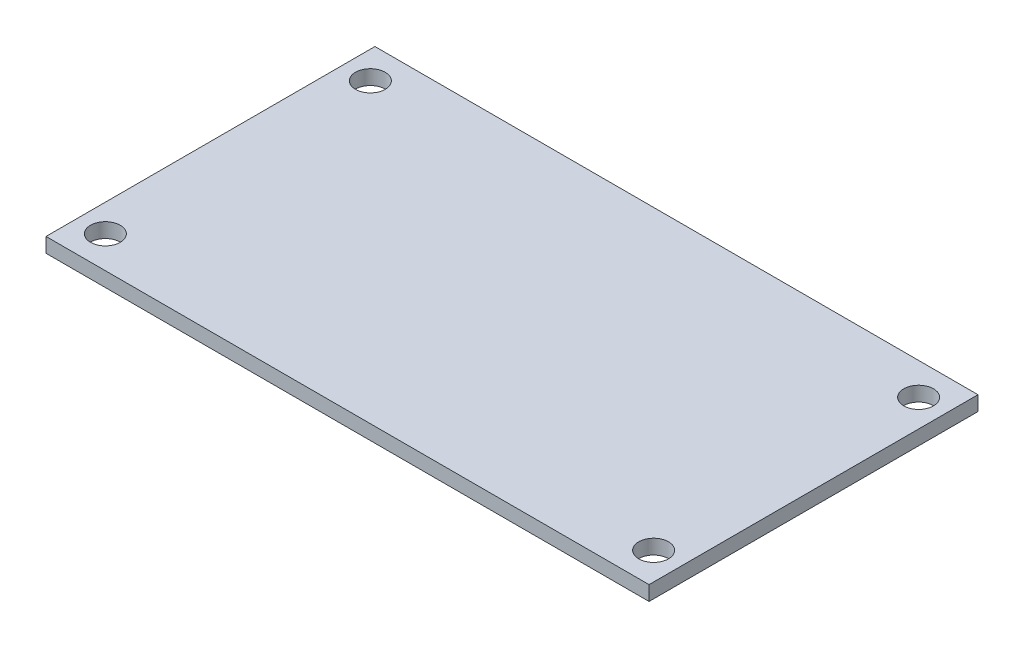
ISO-10303-21;
HEADER;
FILE_DESCRIPTION(('STEP AP214'),'2;1');
FILE_NAME('part.step','',(''),(''),'','','');
FILE_SCHEMA(('AUTOMOTIVE_DESIGN { 1 0 10303 214 1 1 1 1 }'));
ENDSEC;
DATA;
#1=APPLICATION_CONTEXT('core data for automotive mechanical design processes');
#2=APPLICATION_PROTOCOL_DEFINITION('international standard','automotive_design',2000,#1);
#3=PRODUCT_CONTEXT('',#1,'mechanical');
#4=PRODUCT('Part','Part','',(#3));
#5=PRODUCT_RELATED_PRODUCT_CATEGORY('part','',(#4));
#6=PRODUCT_DEFINITION_FORMATION('','',#4);
#7=PRODUCT_DEFINITION_CONTEXT('part definition',#1,'design');
#8=PRODUCT_DEFINITION('design','',#6,#7);
#9=PRODUCT_DEFINITION_SHAPE('','',#8);
#10=(LENGTH_UNIT() NAMED_UNIT(*) SI_UNIT(.MILLI.,.METRE.));
#11=(NAMED_UNIT(*) PLANE_ANGLE_UNIT() SI_UNIT($,.RADIAN.));
#12=(NAMED_UNIT(*) SI_UNIT($,.STERADIAN.) SOLID_ANGLE_UNIT());
#13=UNCERTAINTY_MEASURE_WITH_UNIT(LENGTH_MEASURE(1.E-05),#10,'distance_accuracy_value','');
#14=(GEOMETRIC_REPRESENTATION_CONTEXT(3) GLOBAL_UNCERTAINTY_ASSIGNED_CONTEXT((#13)) GLOBAL_UNIT_ASSIGNED_CONTEXT((#10,
#11,#12)) REPRESENTATION_CONTEXT('',''));
#15=CARTESIAN_POINT('',(0.,0.,0.));
#16=DIRECTION('',(0.,0.,1.));
#17=DIRECTION('',(1.,0.,0.));
#18=AXIS2_PLACEMENT_3D('',#15,#16,#17);
#19=CARTESIAN_POINT('',(0.,1.6,0.));
#20=DIRECTION('',(0.,-1.,0.));
#21=DIRECTION('',(0.,0.,-1.));
#22=AXIS2_PLACEMENT_3D('',#19,#20,#21);
#23=PLANE('',#22);
#24=DIRECTION('',(0.,0.,1.));
#25=VECTOR('',#24,1.);
#26=CARTESIAN_POINT('',(0.,1.6,0.));
#27=LINE('',#26,#25);
#28=CARTESIAN_POINT('',(0.,1.6,-36.));
#29=VERTEX_POINT('',#28);
#30=CARTESIAN_POINT('',(0.,1.6,0.));
#31=VERTEX_POINT('',#30);
#32=EDGE_CURVE('E91',#29,#31,#27,.T.);
#33=ORIENTED_EDGE('',*,*,#32,.T.);
#34=DIRECTION('',(1.,0.,0.));
#35=VECTOR('',#34,1.);
#36=CARTESIAN_POINT('',(0.,1.6,0.));
#37=LINE('',#36,#35);
#38=CARTESIAN_POINT('',(66.,1.6,0.));
#39=VERTEX_POINT('',#38);
#40=EDGE_CURVE('E86',#31,#39,#37,.T.);
#41=ORIENTED_EDGE('',*,*,#40,.T.);
#42=DIRECTION('',(0.,0.,-1.));
#43=VECTOR('',#42,1.);
#44=CARTESIAN_POINT('',(66.,1.6,0.));
#45=LINE('',#44,#43);
#46=CARTESIAN_POINT('',(66.,1.6,-36.));
#47=VERTEX_POINT('',#46);
#48=EDGE_CURVE('E89',#39,#47,#45,.T.);
#49=ORIENTED_EDGE('',*,*,#48,.T.);
#50=DIRECTION('',(-1.,0.,0.));
#51=VECTOR('',#50,1.);
#52=CARTESIAN_POINT('',(0.,1.6,-36.));
#53=LINE('',#52,#51);
#54=EDGE_CURVE('E56',#47,#29,#53,.T.);
#55=ORIENTED_EDGE('',*,*,#54,.T.);
#56=EDGE_LOOP('',(#33,#41,#49,#55));
#57=FACE_BOUND('',#56,.T.);
#58=CARTESIAN_POINT('',(2.99999999999998,1.6,-32.5));
#59=DIRECTION('',(0.,1.,0.));
#60=DIRECTION('',(0.,0.,1.));
#61=AXIS2_PLACEMENT_3D('',#58,#59,#60);
#62=CIRCLE('',#61,1.625);
#63=CARTESIAN_POINT('',(2.99999999999998,1.6,-30.875));
#64=VERTEX_POINT('',#63);
#65=EDGE_CURVE('E106',#64,#64,#62,.T.);
#66=ORIENTED_EDGE('',*,*,#65,.F.);
#67=EDGE_LOOP('',(#66));
#68=FACE_BOUND('',#67,.T.);
#69=CARTESIAN_POINT('',(2.99999999999999,1.6,-3.50000000000001));
#70=DIRECTION('',(0.,1.,0.));
#71=DIRECTION('',(0.,0.,1.));
#72=AXIS2_PLACEMENT_3D('',#69,#70,#71);
#73=CIRCLE('',#72,1.625);
#74=CARTESIAN_POINT('',(2.99999999999999,1.6,-1.87500000000001));
#75=VERTEX_POINT('',#74);
#76=EDGE_CURVE('E121',#75,#75,#73,.T.);
#77=ORIENTED_EDGE('',*,*,#76,.F.);
#78=EDGE_LOOP('',(#77));
#79=FACE_BOUND('',#78,.T.);
#80=CARTESIAN_POINT('',(63.,1.6,-3.50000000000001));
#81=DIRECTION('',(0.,1.,0.));
#82=DIRECTION('',(0.,0.,1.));
#83=AXIS2_PLACEMENT_3D('',#80,#81,#82);
#84=CIRCLE('',#83,1.625);
#85=CARTESIAN_POINT('',(63.,1.6,-1.87500000000001));
#86=VERTEX_POINT('',#85);
#87=EDGE_CURVE('E127',#86,#86,#84,.T.);
#88=ORIENTED_EDGE('',*,*,#87,.F.);
#89=EDGE_LOOP('',(#88));
#90=FACE_BOUND('',#89,.T.);
#91=CARTESIAN_POINT('',(63.,1.6,-32.5));
#92=DIRECTION('',(0.,1.,0.));
#93=DIRECTION('',(0.,0.,1.));
#94=AXIS2_PLACEMENT_3D('',#91,#92,#93);
#95=CIRCLE('',#94,1.625);
#96=CARTESIAN_POINT('',(63.,1.6,-30.875));
#97=VERTEX_POINT('',#96);
#98=EDGE_CURVE('E133',#97,#97,#95,.T.);
#99=ORIENTED_EDGE('',*,*,#98,.F.);
#100=EDGE_LOOP('',(#99));
#101=FACE_BOUND('',#100,.T.);
#102=ADVANCED_FACE('F39',(#57,#68,#79,#90,#101),#23,.F.);
#103=CARTESIAN_POINT('',(0.,0.,0.));
#104=DIRECTION('',(0.,-1.,0.));
#105=DIRECTION('',(0.,0.,-1.));
#106=AXIS2_PLACEMENT_3D('',#103,#104,#105);
#107=PLANE('',#106);
#108=CARTESIAN_POINT('',(63.,0.,-3.50000000000001));
#109=DIRECTION('',(0.,1.,0.));
#110=DIRECTION('',(0.,0.,1.));
#111=AXIS2_PLACEMENT_3D('',#108,#109,#110);
#112=CIRCLE('',#111,1.625);
#113=CARTESIAN_POINT('',(63.,0.,-1.87500000000001));
#114=VERTEX_POINT('',#113);
#115=EDGE_CURVE('E130',#114,#114,#112,.T.);
#116=ORIENTED_EDGE('',*,*,#115,.T.);
#117=EDGE_LOOP('',(#116));
#118=FACE_BOUND('',#117,.T.);
#119=CARTESIAN_POINT('',(2.99999999999998,0.,-32.5));
#120=DIRECTION('',(0.,1.,0.));
#121=DIRECTION('',(0.,0.,1.));
#122=AXIS2_PLACEMENT_3D('',#119,#120,#121);
#123=CIRCLE('',#122,1.625);
#124=CARTESIAN_POINT('',(2.99999999999998,0.,-30.875));
#125=VERTEX_POINT('',#124);
#126=EDGE_CURVE('E118',#125,#125,#123,.T.);
#127=ORIENTED_EDGE('',*,*,#126,.T.);
#128=EDGE_LOOP('',(#127));
#129=FACE_BOUND('',#128,.T.);
#130=DIRECTION('',(0.,0.,1.));
#131=VECTOR('',#130,1.);
#132=CARTESIAN_POINT('',(0.,0.,0.));
#133=LINE('',#132,#131);
#134=CARTESIAN_POINT('',(0.,0.,-36.));
#135=VERTEX_POINT('',#134);
#136=CARTESIAN_POINT('',(0.,0.,0.));
#137=VERTEX_POINT('',#136);
#138=EDGE_CURVE('E103',#135,#137,#133,.T.);
#139=ORIENTED_EDGE('',*,*,#138,.F.);
#140=DIRECTION('',(-1.,0.,0.));
#141=VECTOR('',#140,1.);
#142=CARTESIAN_POINT('',(0.,0.,-36.));
#143=LINE('',#142,#141);
#144=CARTESIAN_POINT('',(66.,0.,-36.));
#145=VERTEX_POINT('',#144);
#146=EDGE_CURVE('E79',#145,#135,#143,.T.);
#147=ORIENTED_EDGE('',*,*,#146,.F.);
#148=DIRECTION('',(0.,0.,-1.));
#149=VECTOR('',#148,1.);
#150=CARTESIAN_POINT('',(66.,0.,0.));
#151=LINE('',#150,#149);
#152=CARTESIAN_POINT('',(66.,0.,0.));
#153=VERTEX_POINT('',#152);
#154=EDGE_CURVE('E73',#153,#145,#151,.T.);
#155=ORIENTED_EDGE('',*,*,#154,.F.);
#156=DIRECTION('',(1.,0.,0.));
#157=VECTOR('',#156,1.);
#158=CARTESIAN_POINT('',(0.,0.,0.));
#159=LINE('',#158,#157);
#160=EDGE_CURVE('E95',#137,#153,#159,.T.);
#161=ORIENTED_EDGE('',*,*,#160,.F.);
#162=EDGE_LOOP('',(#139,#147,#155,#161));
#163=FACE_BOUND('',#162,.T.);
#164=CARTESIAN_POINT('',(2.99999999999999,0.,-3.50000000000001));
#165=DIRECTION('',(0.,1.,0.));
#166=DIRECTION('',(0.,0.,1.));
#167=AXIS2_PLACEMENT_3D('',#164,#165,#166);
#168=CIRCLE('',#167,1.625);
#169=CARTESIAN_POINT('',(2.99999999999999,0.,-1.87500000000001));
#170=VERTEX_POINT('',#169);
#171=EDGE_CURVE('E124',#170,#170,#168,.T.);
#172=ORIENTED_EDGE('',*,*,#171,.T.);
#173=EDGE_LOOP('',(#172));
#174=FACE_BOUND('',#173,.T.);
#175=CARTESIAN_POINT('',(63.,0.,-32.5));
#176=DIRECTION('',(0.,1.,0.));
#177=DIRECTION('',(0.,0.,1.));
#178=AXIS2_PLACEMENT_3D('',#175,#176,#177);
#179=CIRCLE('',#178,1.625);
#180=CARTESIAN_POINT('',(63.,0.,-30.875));
#181=VERTEX_POINT('',#180);
#182=EDGE_CURVE('E136',#181,#181,#179,.T.);
#183=ORIENTED_EDGE('',*,*,#182,.T.);
#184=EDGE_LOOP('',(#183));
#185=FACE_BOUND('',#184,.T.);
#186=ADVANCED_FACE('F114',(#118,#129,#163,#174,#185),#107,.T.);
#187=CARTESIAN_POINT('',(0.,1.6,0.));
#188=DIRECTION('',(1.,0.,0.));
#189=DIRECTION('',(0.,0.,-1.));
#190=AXIS2_PLACEMENT_3D('',#187,#188,#189);
#191=PLANE('',#190);
#192=ORIENTED_EDGE('',*,*,#138,.T.);
#193=DIRECTION('',(0.,-1.,0.));
#194=VECTOR('',#193,1.);
#195=CARTESIAN_POINT('',(0.,1.6,0.));
#196=LINE('',#195,#194);
#197=EDGE_CURVE('E11',#31,#137,#196,.T.);
#198=ORIENTED_EDGE('',*,*,#197,.F.);
#199=ORIENTED_EDGE('',*,*,#32,.F.);
#200=DIRECTION('',(0.,-1.,0.));
#201=VECTOR('',#200,1.);
#202=CARTESIAN_POINT('',(0.,1.6,-36.));
#203=LINE('',#202,#201);
#204=EDGE_CURVE('E99',#29,#135,#203,.T.);
#205=ORIENTED_EDGE('',*,*,#204,.T.);
#206=EDGE_LOOP('',(#192,#198,#199,#205));
#207=FACE_BOUND('',#206,.T.);
#208=ADVANCED_FACE('F41',(#207),#191,.F.);
#209=CARTESIAN_POINT('',(0.,1.6,0.));
#210=DIRECTION('',(0.,0.,-1.));
#211=DIRECTION('',(-1.,0.,0.));
#212=AXIS2_PLACEMENT_3D('',#209,#210,#211);
#213=PLANE('',#212);
#214=ORIENTED_EDGE('',*,*,#160,.T.);
#215=DIRECTION('',(0.,-1.,0.));
#216=VECTOR('',#215,1.);
#217=CARTESIAN_POINT('',(66.,1.6,0.));
#218=LINE('',#217,#216);
#219=EDGE_CURVE('E48',#39,#153,#218,.T.);
#220=ORIENTED_EDGE('',*,*,#219,.F.);
#221=ORIENTED_EDGE('',*,*,#40,.F.);
#222=ORIENTED_EDGE('',*,*,#197,.T.);
#223=EDGE_LOOP('',(#214,#220,#221,#222));
#224=FACE_BOUND('',#223,.T.);
#225=ADVANCED_FACE('F94',(#224),#213,.F.);
#226=CARTESIAN_POINT('',(66.,1.6,0.));
#227=DIRECTION('',(-1.,0.,0.));
#228=DIRECTION('',(0.,0.,1.));
#229=AXIS2_PLACEMENT_3D('',#226,#227,#228);
#230=PLANE('',#229);
#231=ORIENTED_EDGE('',*,*,#154,.T.);
#232=DIRECTION('',(0.,-1.,0.));
#233=VECTOR('',#232,1.);
#234=CARTESIAN_POINT('',(66.,1.6,-36.));
#235=LINE('',#234,#233);
#236=EDGE_CURVE('E96',#47,#145,#235,.T.);
#237=ORIENTED_EDGE('',*,*,#236,.F.);
#238=ORIENTED_EDGE('',*,*,#48,.F.);
#239=ORIENTED_EDGE('',*,*,#219,.T.);
#240=EDGE_LOOP('',(#231,#237,#238,#239));
#241=FACE_BOUND('',#240,.T.);
#242=ADVANCED_FACE('F97',(#241),#230,.F.);
#243=CARTESIAN_POINT('',(0.,1.6,-36.));
#244=DIRECTION('',(0.,0.,1.));
#245=DIRECTION('',(1.,0.,0.));
#246=AXIS2_PLACEMENT_3D('',#243,#244,#245);
#247=PLANE('',#246);
#248=ORIENTED_EDGE('',*,*,#146,.T.);
#249=ORIENTED_EDGE('',*,*,#204,.F.);
#250=ORIENTED_EDGE('',*,*,#54,.F.);
#251=ORIENTED_EDGE('',*,*,#236,.T.);
#252=EDGE_LOOP('',(#248,#249,#250,#251));
#253=FACE_BOUND('',#252,.T.);
#254=ADVANCED_FACE('F111',(#253),#247,.F.);
#255=CARTESIAN_POINT('',(2.99999999999998,1.6,-32.5));
#256=DIRECTION('',(0.,-1.,0.));
#257=DIRECTION('',(0.,0.,-1.));
#258=AXIS2_PLACEMENT_3D('',#255,#256,#257);
#259=CYLINDRICAL_SURFACE('',#258,1.625);
#260=ORIENTED_EDGE('',*,*,#65,.T.);
#261=EDGE_LOOP('',(#260));
#262=FACE_BOUND('',#261,.T.);
#263=ORIENTED_EDGE('',*,*,#126,.F.);
#264=EDGE_LOOP('',(#263));
#265=FACE_BOUND('',#264,.T.);
#266=ADVANCED_FACE('F153',(#262,#265),#259,.F.);
#267=CARTESIAN_POINT('',(2.99999999999999,1.6,-3.50000000000001));
#268=DIRECTION('',(0.,-1.,0.));
#269=DIRECTION('',(0.,0.,-1.));
#270=AXIS2_PLACEMENT_3D('',#267,#268,#269);
#271=CYLINDRICAL_SURFACE('',#270,1.625);
#272=ORIENTED_EDGE('',*,*,#76,.T.);
#273=EDGE_LOOP('',(#272));
#274=FACE_BOUND('',#273,.T.);
#275=ORIENTED_EDGE('',*,*,#171,.F.);
#276=EDGE_LOOP('',(#275));
#277=FACE_BOUND('',#276,.T.);
#278=ADVANCED_FACE('F198',(#274,#277),#271,.F.);
#279=CARTESIAN_POINT('',(63.,1.6,-3.50000000000001));
#280=DIRECTION('',(0.,-1.,0.));
#281=DIRECTION('',(0.,0.,-1.));
#282=AXIS2_PLACEMENT_3D('',#279,#280,#281);
#283=CYLINDRICAL_SURFACE('',#282,1.625);
#284=ORIENTED_EDGE('',*,*,#87,.T.);
#285=EDGE_LOOP('',(#284));
#286=FACE_BOUND('',#285,.T.);
#287=ORIENTED_EDGE('',*,*,#115,.F.);
#288=EDGE_LOOP('',(#287));
#289=FACE_BOUND('',#288,.T.);
#290=ADVANCED_FACE('F206',(#286,#289),#283,.F.);
#291=CARTESIAN_POINT('',(63.,1.6,-32.5));
#292=DIRECTION('',(0.,-1.,0.));
#293=DIRECTION('',(0.,0.,-1.));
#294=AXIS2_PLACEMENT_3D('',#291,#292,#293);
#295=CYLINDRICAL_SURFACE('',#294,1.625);
#296=ORIENTED_EDGE('',*,*,#98,.T.);
#297=EDGE_LOOP('',(#296));
#298=FACE_BOUND('',#297,.T.);
#299=ORIENTED_EDGE('',*,*,#182,.F.);
#300=EDGE_LOOP('',(#299));
#301=FACE_BOUND('',#300,.T.);
#302=ADVANCED_FACE('F142',(#298,#301),#295,.F.);
#303=CLOSED_SHELL('',(#102,#186,#208,#225,#242,#254,#266,#278,#290,#302));
#304=MANIFOLD_SOLID_BREP('B2',#303);
#305=ADVANCED_BREP_SHAPE_REPRESENTATION('',(#18,#304),#14);
#306=SHAPE_DEFINITION_REPRESENTATION(#9,#305);
ENDSEC;
END-ISO-10303-21;
